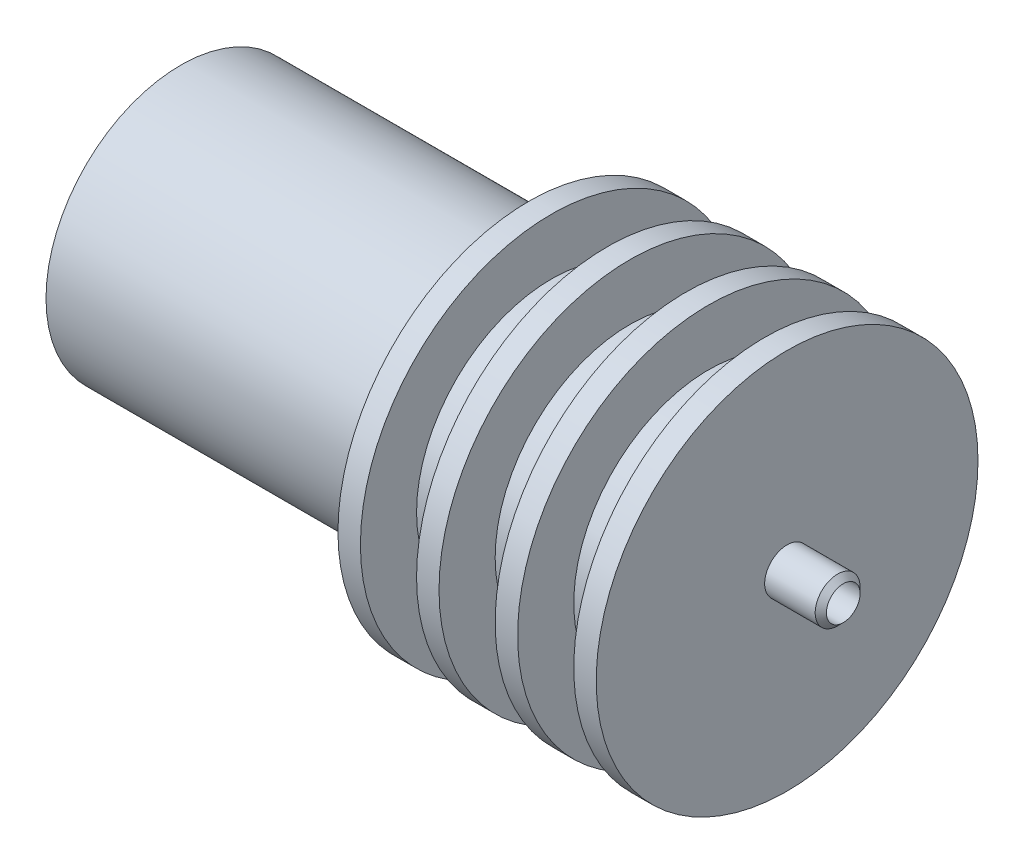
ISO-10303-21;
HEADER;
FILE_DESCRIPTION(('STEP AP214'),'2;1');
FILE_NAME('part.step','',(''),(''),'','','');
FILE_SCHEMA(('AUTOMOTIVE_DESIGN { 1 0 10303 214 1 1 1 1 }'));
ENDSEC;
DATA;
#1=APPLICATION_CONTEXT('core data for automotive mechanical design processes');
#2=APPLICATION_PROTOCOL_DEFINITION('international standard','automotive_design',2000,#1);
#3=PRODUCT_CONTEXT('',#1,'mechanical');
#4=PRODUCT('Part','Part','',(#3));
#5=PRODUCT_RELATED_PRODUCT_CATEGORY('part','',(#4));
#6=PRODUCT_DEFINITION_FORMATION('','',#4);
#7=PRODUCT_DEFINITION_CONTEXT('part definition',#1,'design');
#8=PRODUCT_DEFINITION('design','',#6,#7);
#9=PRODUCT_DEFINITION_SHAPE('','',#8);
#10=(LENGTH_UNIT() NAMED_UNIT(*) SI_UNIT(.MILLI.,.METRE.));
#11=(NAMED_UNIT(*) PLANE_ANGLE_UNIT() SI_UNIT($,.RADIAN.));
#12=(NAMED_UNIT(*) SI_UNIT($,.STERADIAN.) SOLID_ANGLE_UNIT());
#13=UNCERTAINTY_MEASURE_WITH_UNIT(LENGTH_MEASURE(1.E-05),#10,'distance_accuracy_value','');
#14=(GEOMETRIC_REPRESENTATION_CONTEXT(3) GLOBAL_UNCERTAINTY_ASSIGNED_CONTEXT((#13)) GLOBAL_UNIT_ASSIGNED_CONTEXT((#10,
#11,#12)) REPRESENTATION_CONTEXT('',''));
#15=CARTESIAN_POINT('',(0.,0.,0.));
#16=DIRECTION('',(0.,0.,1.));
#17=DIRECTION('',(1.,0.,0.));
#18=AXIS2_PLACEMENT_3D('',#15,#16,#17);
#19=CARTESIAN_POINT('',(28.,0.,0.));
#20=DIRECTION('',(1.,0.,0.));
#21=DIRECTION('',(0.,0.,-1.));
#22=AXIS2_PLACEMENT_3D('',#19,#20,#21);
#23=PLANE('',#22);
#24=CARTESIAN_POINT('',(28.,0.,0.));
#25=DIRECTION('',(1.,0.,0.));
#26=DIRECTION('',(0.,0.,-1.));
#27=AXIS2_PLACEMENT_3D('',#24,#25,#26);
#28=CIRCLE('',#27,17.);
#29=CARTESIAN_POINT('',(28.,0.,-17.));
#30=VERTEX_POINT('',#29);
#31=EDGE_CURVE('E101',#30,#30,#28,.T.);
#32=ORIENTED_EDGE('',*,*,#31,.T.);
#33=EDGE_LOOP('',(#32));
#34=FACE_BOUND('',#33,.T.);
#35=CARTESIAN_POINT('',(28.,0.,0.));
#36=DIRECTION('',(1.,0.,0.));
#37=DIRECTION('',(0.,0.,-1.));
#38=AXIS2_PLACEMENT_3D('',#35,#36,#37);
#39=CIRCLE('',#38,2.);
#40=CARTESIAN_POINT('',(28.,0.,-2.));
#41=VERTEX_POINT('',#40);
#42=EDGE_CURVE('E105',#41,#41,#39,.T.);
#43=ORIENTED_EDGE('',*,*,#42,.F.);
#44=EDGE_LOOP('',(#43));
#45=FACE_BOUND('',#44,.T.);
#46=ADVANCED_FACE('F62',(#34,#45),#23,.T.);
#47=CARTESIAN_POINT('',(28.,0.,0.));
#48=DIRECTION('',(-1.,0.,0.));
#49=DIRECTION('',(0.,0.,1.));
#50=AXIS2_PLACEMENT_3D('',#47,#48,#49);
#51=CYLINDRICAL_SURFACE('',#50,12.);
#52=CARTESIAN_POINT('',(23.,0.,0.));
#53=DIRECTION('',(1.,0.,0.));
#54=DIRECTION('',(0.,0.,-1.));
#55=AXIS2_PLACEMENT_3D('',#52,#53,#54);
#56=CIRCLE('',#55,12.);
#57=CARTESIAN_POINT('',(23.,0.,-12.));
#58=VERTEX_POINT('',#57);
#59=EDGE_CURVE('E79',#58,#58,#56,.T.);
#60=ORIENTED_EDGE('',*,*,#59,.T.);
#61=EDGE_LOOP('',(#60));
#62=FACE_BOUND('',#61,.T.);
#63=CARTESIAN_POINT('',(26.,0.,0.));
#64=DIRECTION('',(1.,0.,0.));
#65=DIRECTION('',(0.,0.,-1.));
#66=AXIS2_PLACEMENT_3D('',#63,#64,#65);
#67=CIRCLE('',#66,12.);
#68=CARTESIAN_POINT('',(26.,0.,-12.));
#69=VERTEX_POINT('',#68);
#70=EDGE_CURVE('E71',#69,#69,#67,.T.);
#71=ORIENTED_EDGE('',*,*,#70,.F.);
#72=EDGE_LOOP('',(#71));
#73=FACE_BOUND('',#72,.T.);
#74=ADVANCED_FACE('F128',(#62,#73),#51,.T.);
#75=CARTESIAN_POINT('',(23.,0.,0.));
#76=DIRECTION('',(1.,0.,0.));
#77=DIRECTION('',(0.,0.,-1.));
#78=AXIS2_PLACEMENT_3D('',#75,#76,#77);
#79=PLANE('',#78);
#80=CARTESIAN_POINT('',(23.,0.,0.));
#81=DIRECTION('',(1.,0.,0.));
#82=DIRECTION('',(0.,0.,-1.));
#83=AXIS2_PLACEMENT_3D('',#80,#81,#82);
#84=CIRCLE('',#83,10.);
#85=CARTESIAN_POINT('',(23.,0.,10.));
#86=VERTEX_POINT('',#85);
#87=EDGE_CURVE('E87',#86,#86,#84,.T.);
#88=ORIENTED_EDGE('',*,*,#87,.T.);
#89=EDGE_LOOP('',(#88));
#90=FACE_BOUND('',#89,.T.);
#91=ORIENTED_EDGE('',*,*,#59,.F.);
#92=EDGE_LOOP('',(#91));
#93=FACE_BOUND('',#92,.T.);
#94=ADVANCED_FACE('F134',(#90,#93),#79,.F.);
#95=CARTESIAN_POINT('',(26.,0.,0.));
#96=DIRECTION('',(-1.,0.,0.));
#97=DIRECTION('',(0.,0.,1.));
#98=AXIS2_PLACEMENT_3D('',#95,#96,#97);
#99=CYLINDRICAL_SURFACE('',#98,10.);
#100=CARTESIAN_POINT('',(26.,0.,0.));
#101=DIRECTION('',(-1.,0.,0.));
#102=DIRECTION('',(0.,0.,1.));
#103=AXIS2_PLACEMENT_3D('',#100,#101,#102);
#104=CIRCLE('',#103,10.);
#105=CARTESIAN_POINT('',(26.,0.,10.));
#106=VERTEX_POINT('',#105);
#107=EDGE_CURVE('E93',#106,#106,#104,.T.);
#108=CARTESIAN_POINT('',(26.,0.,10.));
#109=CARTESIAN_POINT('',(25.96875,0.,10.));
#110=CARTESIAN_POINT('',(25.9375,0.,10.));
#111=CARTESIAN_POINT('',(25.875,0.,10.));
#112=CARTESIAN_POINT('',(25.84375,0.,10.));
#113=CARTESIAN_POINT('',(25.78125,0.,10.));
#114=CARTESIAN_POINT('',(25.75,0.,10.));
#115=CARTESIAN_POINT('',(25.6875,0.,10.));
#116=CARTESIAN_POINT('',(25.65625,0.,10.));
#117=CARTESIAN_POINT('',(25.59375,0.,10.));
#118=CARTESIAN_POINT('',(25.5625,0.,10.));
#119=CARTESIAN_POINT('',(25.5,0.,10.));
#120=CARTESIAN_POINT('',(25.46875,0.,10.));
#121=CARTESIAN_POINT('',(25.40625,0.,10.));
#122=CARTESIAN_POINT('',(25.375,0.,10.));
#123=CARTESIAN_POINT('',(25.3125,0.,10.));
#124=CARTESIAN_POINT('',(25.28125,0.,10.));
#125=CARTESIAN_POINT('',(25.21875,0.,10.));
#126=CARTESIAN_POINT('',(25.1875,0.,10.));
#127=CARTESIAN_POINT('',(25.125,0.,10.));
#128=CARTESIAN_POINT('',(25.09375,0.,10.));
#129=CARTESIAN_POINT('',(25.03125,0.,10.));
#130=CARTESIAN_POINT('',(25.,0.,10.));
#131=CARTESIAN_POINT('',(24.9375,0.,10.));
#132=CARTESIAN_POINT('',(24.90625,0.,10.));
#133=CARTESIAN_POINT('',(24.84375,0.,10.));
#134=CARTESIAN_POINT('',(24.8125,0.,10.));
#135=CARTESIAN_POINT('',(24.75,0.,10.));
#136=CARTESIAN_POINT('',(24.71875,0.,10.));
#137=CARTESIAN_POINT('',(24.65625,0.,10.));
#138=CARTESIAN_POINT('',(24.625,0.,10.));
#139=CARTESIAN_POINT('',(24.5625,0.,10.));
#140=CARTESIAN_POINT('',(24.53125,0.,10.));
#141=CARTESIAN_POINT('',(24.46875,0.,10.));
#142=CARTESIAN_POINT('',(24.4375,0.,10.));
#143=CARTESIAN_POINT('',(24.375,0.,10.));
#144=CARTESIAN_POINT('',(24.34375,0.,10.));
#145=CARTESIAN_POINT('',(24.28125,0.,10.));
#146=CARTESIAN_POINT('',(24.25,0.,10.));
#147=CARTESIAN_POINT('',(24.1875,0.,10.));
#148=CARTESIAN_POINT('',(24.15625,0.,10.));
#149=CARTESIAN_POINT('',(24.09375,0.,10.));
#150=CARTESIAN_POINT('',(24.0625,0.,10.));
#151=CARTESIAN_POINT('',(24.,0.,10.));
#152=CARTESIAN_POINT('',(23.96875,0.,10.));
#153=CARTESIAN_POINT('',(23.90625,0.,10.));
#154=CARTESIAN_POINT('',(23.875,0.,10.));
#155=CARTESIAN_POINT('',(23.8125,0.,10.));
#156=CARTESIAN_POINT('',(23.78125,0.,10.));
#157=CARTESIAN_POINT('',(23.71875,0.,10.));
#158=CARTESIAN_POINT('',(23.6875,0.,10.));
#159=CARTESIAN_POINT('',(23.625,0.,10.));
#160=CARTESIAN_POINT('',(23.59375,0.,10.));
#161=CARTESIAN_POINT('',(23.53125,0.,10.));
#162=CARTESIAN_POINT('',(23.5,0.,10.));
#163=CARTESIAN_POINT('',(23.4375,0.,10.));
#164=CARTESIAN_POINT('',(23.40625,0.,10.));
#165=CARTESIAN_POINT('',(23.34375,0.,10.));
#166=CARTESIAN_POINT('',(23.3125,0.,10.));
#167=CARTESIAN_POINT('',(23.25,0.,10.));
#168=CARTESIAN_POINT('',(23.21875,0.,10.));
#169=CARTESIAN_POINT('',(23.15625,0.,10.));
#170=CARTESIAN_POINT('',(23.125,0.,10.));
#171=CARTESIAN_POINT('',(23.0625,0.,10.));
#172=CARTESIAN_POINT('',(23.03125,0.,10.));
#173=CARTESIAN_POINT('',(23.,0.,10.));
#174=B_SPLINE_CURVE_WITH_KNOTS('',3,(#108,#109,#110,#111,#112,#113,#114,#115,#116,#117,#118,
#119,#120,#121,#122,#123,#124,#125,#126,#127,#128,#129,#130,#131,#132,#133,#134,#135,#136,#137,
#138,#139,#140,#141,#142,#143,#144,#145,#146,#147,#148,#149,#150,#151,#152,#153,#154,#155,#156,
#157,#158,#159,#160,#161,#162,#163,#164,#165,#166,#167,#168,#169,#170,#171,#172,#173),
.UNSPECIFIED.,.F.,.F.,(4,2,2,2,2,2,2,2,2,2,2,2,2,2,2,2,2,2,2,2,2,2,2,2,2,2,2,2,2,2,2,2,4),(0.,
0.0937500000000001,0.1875,0.28125,0.375,0.46875,0.5625,0.656250000000001,0.750000000000001,
0.843750000000001,0.937500000000001,1.03125,1.125,1.21875,1.3125,1.40625,1.5,1.59375,1.6875,
1.78125,1.875,1.96875,2.0625,2.15625,2.25,2.34375,2.4375,2.53125,2.625,2.71875,2.8125,2.90625,
3.),.UNSPECIFIED.);
#175=EDGE_CURVE('BSEAM139',#106,#86,#174,.T.);
#176=ORIENTED_EDGE('',*,*,#107,.F.);
#177=ORIENTED_EDGE('',*,*,#87,.F.);
#178=ORIENTED_EDGE('',*,*,#175,.T.);
#179=ORIENTED_EDGE('',*,*,#175,.F.);
#180=EDGE_LOOP('',(#176,#178,#177,#179));
#181=FACE_BOUND('',#180,.T.);
#182=ADVANCED_FACE('F139',(#181),#99,.F.);
#183=CARTESIAN_POINT('',(26.,0.,0.));
#184=DIRECTION('',(-1.,0.,0.));
#185=DIRECTION('',(0.,0.,1.));
#186=AXIS2_PLACEMENT_3D('',#183,#184,#185);
#187=PLANE('',#186);
#188=CARTESIAN_POINT('',(26.,0.,0.));
#189=DIRECTION('',(-1.,0.,0.));
#190=DIRECTION('',(0.,0.,1.));
#191=AXIS2_PLACEMENT_3D('',#188,#189,#190);
#192=CIRCLE('',#191,1.5);
#193=CARTESIAN_POINT('',(26.,0.,1.5));
#194=VERTEX_POINT('',#193);
#195=EDGE_CURVE('E90',#194,#194,#192,.T.);
#196=ORIENTED_EDGE('',*,*,#195,.F.);
#197=EDGE_LOOP('',(#196));
#198=FACE_BOUND('',#197,.T.);
#199=ORIENTED_EDGE('',*,*,#107,.T.);
#200=EDGE_LOOP('',(#199));
#201=FACE_BOUND('',#200,.T.);
#202=ADVANCED_FACE('F146',(#198,#201),#187,.T.);
#203=CARTESIAN_POINT('',(-26.,0.,0.));
#204=DIRECTION('',(1.,0.,0.));
#205=DIRECTION('',(0.,0.,-1.));
#206=AXIS2_PLACEMENT_3D('',#203,#204,#205);
#207=CYLINDRICAL_SURFACE('',#206,1.5);
#208=ORIENTED_EDGE('',*,*,#195,.T.);
#209=EDGE_LOOP('',(#208));
#210=FACE_BOUND('',#209,.T.);
#211=CARTESIAN_POINT('',(33.,0.,0.));
#212=DIRECTION('',(1.,0.,0.));
#213=DIRECTION('',(0.,0.,-1.));
#214=AXIS2_PLACEMENT_3D('',#211,#212,#213);
#215=CIRCLE('',#214,1.5);
#216=CARTESIAN_POINT('',(33.,0.,-1.5));
#217=VERTEX_POINT('',#216);
#218=EDGE_CURVE('E111',#217,#217,#215,.T.);
#219=ORIENTED_EDGE('',*,*,#218,.T.);
#220=EDGE_LOOP('',(#219));
#221=FACE_BOUND('',#220,.T.);
#222=ADVANCED_FACE('F118',(#210,#221),#207,.F.);
#223=CARTESIAN_POINT('',(26.,0.,0.));
#224=DIRECTION('',(1.,0.,0.));
#225=DIRECTION('',(0.,0.,-1.));
#226=AXIS2_PLACEMENT_3D('',#223,#224,#225);
#227=CYLINDRICAL_SURFACE('',#226,17.);
#228=CARTESIAN_POINT('',(26.,0.,0.));
#229=DIRECTION('',(1.,0.,0.));
#230=DIRECTION('',(0.,0.,-1.));
#231=AXIS2_PLACEMENT_3D('',#228,#229,#230);
#232=CIRCLE('',#231,17.);
#233=CARTESIAN_POINT('',(26.,0.,-17.));
#234=VERTEX_POINT('',#233);
#235=EDGE_CURVE('E94',#234,#234,#232,.T.);
#236=ORIENTED_EDGE('',*,*,#235,.T.);
#237=EDGE_LOOP('',(#236));
#238=FACE_BOUND('',#237,.T.);
#239=ORIENTED_EDGE('',*,*,#31,.F.);
#240=EDGE_LOOP('',(#239));
#241=FACE_BOUND('',#240,.T.);
#242=ADVANCED_FACE('F161',(#238,#241),#227,.T.);
#243=CARTESIAN_POINT('',(26.,0.,0.));
#244=DIRECTION('',(1.,0.,0.));
#245=DIRECTION('',(0.,0.,-1.));
#246=AXIS2_PLACEMENT_3D('',#243,#244,#245);
#247=PLANE('',#246);
#248=ORIENTED_EDGE('',*,*,#70,.T.);
#249=EDGE_LOOP('',(#248));
#250=FACE_BOUND('',#249,.T.);
#251=ORIENTED_EDGE('',*,*,#235,.F.);
#252=EDGE_LOOP('',(#251));
#253=FACE_BOUND('',#252,.T.);
#254=ADVANCED_FACE('F125',(#250,#253),#247,.F.);
#255=CARTESIAN_POINT('',(33.,0.,0.));
#256=DIRECTION('',(-1.,0.,0.));
#257=DIRECTION('',(0.,0.,1.));
#258=AXIS2_PLACEMENT_3D('',#255,#256,#257);
#259=CYLINDRICAL_SURFACE('',#258,2.);
#260=CARTESIAN_POINT('',(32.5,0.,0.));
#261=DIRECTION('',(1.,0.,0.));
#262=DIRECTION('',(0.,0.,-1.));
#263=AXIS2_PLACEMENT_3D('',#260,#261,#262);
#264=CIRCLE('',#263,2.);
#265=CARTESIAN_POINT('',(32.5,0.,-2.));
#266=VERTEX_POINT('',#265);
#267=EDGE_CURVE('E12',#266,#266,#264,.F.);
#268=ORIENTED_EDGE('',*,*,#267,.T.);
#269=EDGE_LOOP('',(#268));
#270=FACE_BOUND('',#269,.T.);
#271=ORIENTED_EDGE('',*,*,#42,.T.);
#272=EDGE_LOOP('',(#271));
#273=FACE_BOUND('',#272,.T.);
#274=ADVANCED_FACE('F121',(#270,#273),#259,.T.);
#275=CARTESIAN_POINT('',(33.,0.,0.));
#276=DIRECTION('',(-1.,0.,0.));
#277=DIRECTION('',(0.,0.,1.));
#278=AXIS2_PLACEMENT_3D('',#275,#276,#277);
#279=CONICAL_SURFACE('',#278,1.50000000000001,0.78539816339744);
#280=ORIENTED_EDGE('',*,*,#267,.F.);
#281=EDGE_LOOP('',(#280));
#282=FACE_BOUND('',#281,.T.);
#283=ORIENTED_EDGE('',*,*,#218,.F.);
#284=EDGE_LOOP('',(#283));
#285=FACE_BOUND('',#284,.T.);
#286=ADVANCED_FACE('F65',(#282,#285),#279,.T.);
#287=CLOSED_SHELL('',(#46,#74,#94,#182,#202,#222,#242,#254,#274,#286));
#288=MANIFOLD_SOLID_BREP('B2',#287);
#289=CARTESIAN_POINT('',(-26.,0.,0.));
#290=DIRECTION('',(-1.,0.,0.));
#291=DIRECTION('',(0.,0.,1.));
#292=AXIS2_PLACEMENT_3D('',#289,#290,#291);
#293=CYLINDRICAL_SURFACE('',#292,12.);
#294=CARTESIAN_POINT('',(12.,0.,0.));
#295=DIRECTION('',(-1.,0.,0.));
#296=DIRECTION('',(0.,0.,1.));
#297=AXIS2_PLACEMENT_3D('',#294,#295,#296);
#298=CIRCLE('',#297,12.);
#299=CARTESIAN_POINT('',(12.,0.,12.));
#300=VERTEX_POINT('',#299);
#301=EDGE_CURVE('E301',#300,#300,#298,.T.);
#302=ORIENTED_EDGE('',*,*,#301,.T.);
#303=EDGE_LOOP('',(#302));
#304=FACE_BOUND('',#303,.T.);
#305=CARTESIAN_POINT('',(6.99999999999999,0.,0.));
#306=DIRECTION('',(-1.,0.,0.));
#307=DIRECTION('',(0.,0.,1.));
#308=AXIS2_PLACEMENT_3D('',#305,#306,#307);
#309=CIRCLE('',#308,12.);
#310=CARTESIAN_POINT('',(6.99999999999999,0.,12.));
#311=VERTEX_POINT('',#310);
#312=EDGE_CURVE('E61',#311,#311,#309,.T.);
#313=ORIENTED_EDGE('',*,*,#312,.F.);
#314=EDGE_LOOP('',(#313));
#315=FACE_BOUND('',#314,.T.);
#316=ADVANCED_FACE('F275',(#304,#315),#293,.T.);
#317=CARTESIAN_POINT('',(19.,0.,0.));
#318=DIRECTION('',(1.,0.,0.));
#319=DIRECTION('',(0.,0.,-1.));
#320=AXIS2_PLACEMENT_3D('',#317,#318,#319);
#321=CIRCLE('',#320,12.);
#322=CARTESIAN_POINT('',(19.,0.,-12.));
#323=VERTEX_POINT('',#322);
#324=EDGE_CURVE('E292',#323,#323,#321,.T.);
#325=ORIENTED_EDGE('',*,*,#324,.F.);
#326=EDGE_LOOP('',(#325));
#327=FACE_BOUND('',#326,.T.);
#328=CARTESIAN_POINT('',(14.,0.,0.));
#329=DIRECTION('',(-1.,0.,0.));
#330=DIRECTION('',(0.,0.,1.));
#331=AXIS2_PLACEMENT_3D('',#328,#329,#330);
#332=CIRCLE('',#331,12.);
#333=CARTESIAN_POINT('',(14.,0.,12.));
#334=VERTEX_POINT('',#333);
#335=EDGE_CURVE('E279',#334,#334,#332,.T.);
#336=ORIENTED_EDGE('',*,*,#335,.F.);
#337=EDGE_LOOP('',(#336));
#338=FACE_BOUND('',#337,.T.);
#339=ADVANCED_FACE('F349',(#327,#338),#293,.T.);
#340=CARTESIAN_POINT('',(4.99999999999999,0.,0.));
#341=DIRECTION('',(-1.,0.,0.));
#342=DIRECTION('',(0.,0.,1.));
#343=AXIS2_PLACEMENT_3D('',#340,#341,#342);
#344=CIRCLE('',#343,12.);
#345=CARTESIAN_POINT('',(4.99999999999999,0.,12.));
#346=VERTEX_POINT('',#345);
#347=EDGE_CURVE('E297',#346,#346,#344,.T.);
#348=ORIENTED_EDGE('',*,*,#347,.T.);
#349=EDGE_LOOP('',(#348));
#350=FACE_BOUND('',#349,.T.);
#351=CARTESIAN_POINT('',(-26.,0.,0.));
#352=DIRECTION('',(-1.,0.,0.));
#353=DIRECTION('',(0.,0.,1.));
#354=AXIS2_PLACEMENT_3D('',#351,#352,#353);
#355=CIRCLE('',#354,12.);
#356=CARTESIAN_POINT('',(-26.,0.,12.));
#357=VERTEX_POINT('',#356);
#358=EDGE_CURVE('E334',#357,#357,#355,.T.);
#359=ORIENTED_EDGE('',*,*,#358,.F.);
#360=EDGE_LOOP('',(#359));
#361=FACE_BOUND('',#360,.T.);
#362=ADVANCED_FACE('F352',(#350,#361),#293,.T.);
#363=CARTESIAN_POINT('',(21.,0.,0.));
#364=DIRECTION('',(1.,0.,0.));
#365=DIRECTION('',(0.,0.,-1.));
#366=AXIS2_PLACEMENT_3D('',#363,#364,#365);
#367=CIRCLE('',#366,12.);
#368=CARTESIAN_POINT('',(21.,0.,-12.));
#369=VERTEX_POINT('',#368);
#370=EDGE_CURVE('E311',#369,#369,#367,.T.);
#371=ORIENTED_EDGE('',*,*,#370,.T.);
#372=EDGE_LOOP('',(#371));
#373=FACE_BOUND('',#372,.T.);
#374=CARTESIAN_POINT('',(23.,0.,0.));
#375=DIRECTION('',(1.,0.,0.));
#376=DIRECTION('',(0.,0.,-1.));
#377=AXIS2_PLACEMENT_3D('',#374,#375,#376);
#378=CIRCLE('',#377,12.);
#379=CARTESIAN_POINT('',(23.,0.,-12.));
#380=VERTEX_POINT('',#379);
#381=EDGE_CURVE('E330',#380,#380,#378,.T.);
#382=ORIENTED_EDGE('',*,*,#381,.F.);
#383=EDGE_LOOP('',(#382));
#384=FACE_BOUND('',#383,.T.);
#385=ADVANCED_FACE('F277',(#373,#384),#293,.T.);
#386=CARTESIAN_POINT('',(-26.,0.,0.));
#387=DIRECTION('',(-1.,0.,0.));
#388=DIRECTION('',(0.,0.,1.));
#389=AXIS2_PLACEMENT_3D('',#386,#387,#388);
#390=CYLINDRICAL_SURFACE('',#389,10.);
#391=CARTESIAN_POINT('',(-26.,0.,0.));
#392=DIRECTION('',(-1.,0.,0.));
#393=DIRECTION('',(0.,0.,1.));
#394=AXIS2_PLACEMENT_3D('',#391,#392,#393);
#395=CIRCLE('',#394,10.);
#396=CARTESIAN_POINT('',(-26.,0.,10.));
#397=VERTEX_POINT('',#396);
#398=EDGE_CURVE('E338',#397,#397,#395,.T.);
#399=ORIENTED_EDGE('',*,*,#398,.T.);
#400=EDGE_LOOP('',(#399));
#401=FACE_BOUND('',#400,.T.);
#402=CARTESIAN_POINT('',(23.,0.,0.));
#403=DIRECTION('',(1.,0.,0.));
#404=DIRECTION('',(0.,0.,-1.));
#405=AXIS2_PLACEMENT_3D('',#402,#403,#404);
#406=CIRCLE('',#405,10.);
#407=CARTESIAN_POINT('',(23.,0.,-10.));
#408=VERTEX_POINT('',#407);
#409=EDGE_CURVE('E323',#408,#408,#406,.T.);
#410=ORIENTED_EDGE('',*,*,#409,.T.);
#411=EDGE_LOOP('',(#410));
#412=FACE_BOUND('',#411,.T.);
#413=ADVANCED_FACE('F377',(#401,#412),#390,.F.);
#414=CARTESIAN_POINT('',(-26.,10.,0.));
#415=DIRECTION('',(1.,0.,0.));
#416=DIRECTION('',(0.,0.,-1.));
#417=AXIS2_PLACEMENT_3D('',#414,#415,#416);
#418=PLANE('',#417);
#419=ORIENTED_EDGE('',*,*,#398,.F.);
#420=EDGE_LOOP('',(#419));
#421=FACE_BOUND('',#420,.T.);
#422=ORIENTED_EDGE('',*,*,#358,.T.);
#423=EDGE_LOOP('',(#422));
#424=FACE_BOUND('',#423,.T.);
#425=ADVANCED_FACE('F383',(#421,#424),#418,.F.);
#426=CARTESIAN_POINT('',(23.,0.,0.));
#427=DIRECTION('',(1.,0.,0.));
#428=DIRECTION('',(0.,0.,-1.));
#429=AXIS2_PLACEMENT_3D('',#426,#427,#428);
#430=PLANE('',#429);
#431=ORIENTED_EDGE('',*,*,#381,.T.);
#432=EDGE_LOOP('',(#431));
#433=FACE_BOUND('',#432,.T.);
#434=ORIENTED_EDGE('',*,*,#409,.F.);
#435=EDGE_LOOP('',(#434));
#436=FACE_BOUND('',#435,.T.);
#437=ADVANCED_FACE('F390',(#433,#436),#430,.T.);
#438=CARTESIAN_POINT('',(19.,0.,0.));
#439=DIRECTION('',(1.,0.,0.));
#440=DIRECTION('',(0.,0.,-1.));
#441=AXIS2_PLACEMENT_3D('',#438,#439,#440);
#442=CYLINDRICAL_SURFACE('',#441,17.);
#443=CARTESIAN_POINT('',(19.,0.,0.));
#444=DIRECTION('',(1.,0.,0.));
#445=DIRECTION('',(0.,0.,-1.));
#446=AXIS2_PLACEMENT_3D('',#443,#444,#445);
#447=CIRCLE('',#446,17.);
#448=CARTESIAN_POINT('',(19.,0.,-17.));
#449=VERTEX_POINT('',#448);
#450=EDGE_CURVE('E319',#449,#449,#447,.T.);
#451=ORIENTED_EDGE('',*,*,#450,.T.);
#452=EDGE_LOOP('',(#451));
#453=FACE_BOUND('',#452,.T.);
#454=CARTESIAN_POINT('',(21.,0.,0.));
#455=DIRECTION('',(1.,0.,0.));
#456=DIRECTION('',(0.,0.,-1.));
#457=AXIS2_PLACEMENT_3D('',#454,#455,#456);
#458=CIRCLE('',#457,17.);
#459=CARTESIAN_POINT('',(21.,0.,-17.));
#460=VERTEX_POINT('',#459);
#461=EDGE_CURVE('E318',#460,#460,#458,.T.);
#462=ORIENTED_EDGE('',*,*,#461,.F.);
#463=EDGE_LOOP('',(#462));
#464=FACE_BOUND('',#463,.T.);
#465=ADVANCED_FACE('F393',(#453,#464),#442,.T.);
#466=CARTESIAN_POINT('',(19.,0.,0.));
#467=DIRECTION('',(1.,0.,0.));
#468=DIRECTION('',(0.,0.,-1.));
#469=AXIS2_PLACEMENT_3D('',#466,#467,#468);
#470=PLANE('',#469);
#471=ORIENTED_EDGE('',*,*,#324,.T.);
#472=EDGE_LOOP('',(#471));
#473=FACE_BOUND('',#472,.T.);
#474=ORIENTED_EDGE('',*,*,#450,.F.);
#475=EDGE_LOOP('',(#474));
#476=FACE_BOUND('',#475,.T.);
#477=ADVANCED_FACE('F346',(#473,#476),#470,.F.);
#478=CARTESIAN_POINT('',(21.,0.,0.));
#479=DIRECTION('',(1.,0.,0.));
#480=DIRECTION('',(0.,0.,-1.));
#481=AXIS2_PLACEMENT_3D('',#478,#479,#480);
#482=PLANE('',#481);
#483=ORIENTED_EDGE('',*,*,#370,.F.);
#484=EDGE_LOOP('',(#483));
#485=FACE_BOUND('',#484,.T.);
#486=ORIENTED_EDGE('',*,*,#461,.T.);
#487=EDGE_LOOP('',(#486));
#488=FACE_BOUND('',#487,.T.);
#489=ADVANCED_FACE('F367',(#485,#488),#482,.T.);
#490=CARTESIAN_POINT('',(12.,0.,0.));
#491=DIRECTION('',(-1.,0.,0.));
#492=DIRECTION('',(0.,0.,1.));
#493=AXIS2_PLACEMENT_3D('',#490,#491,#492);
#494=PLANE('',#493);
#495=CARTESIAN_POINT('',(12.,0.,0.));
#496=DIRECTION('',(-1.,0.,0.));
#497=DIRECTION('',(0.,0.,1.));
#498=AXIS2_PLACEMENT_3D('',#495,#496,#497);
#499=CIRCLE('',#498,17.);
#500=CARTESIAN_POINT('',(12.,0.,17.));
#501=VERTEX_POINT('',#500);
#502=EDGE_CURVE('E307',#501,#501,#499,.T.);
#503=ORIENTED_EDGE('',*,*,#502,.T.);
#504=EDGE_LOOP('',(#503));
#505=FACE_BOUND('',#504,.T.);
#506=ORIENTED_EDGE('',*,*,#301,.F.);
#507=EDGE_LOOP('',(#506));
#508=FACE_BOUND('',#507,.T.);
#509=ADVANCED_FACE('F358',(#505,#508),#494,.T.);
#510=CARTESIAN_POINT('',(14.,0.,0.));
#511=DIRECTION('',(-1.,0.,0.));
#512=DIRECTION('',(0.,0.,1.));
#513=AXIS2_PLACEMENT_3D('',#510,#511,#512);
#514=PLANE('',#513);
#515=CARTESIAN_POINT('',(14.,0.,0.));
#516=DIRECTION('',(-1.,0.,0.));
#517=DIRECTION('',(0.,0.,1.));
#518=AXIS2_PLACEMENT_3D('',#515,#516,#517);
#519=CIRCLE('',#518,17.);
#520=CARTESIAN_POINT('',(14.,0.,17.));
#521=VERTEX_POINT('',#520);
#522=EDGE_CURVE('E306',#521,#521,#519,.T.);
#523=ORIENTED_EDGE('',*,*,#522,.F.);
#524=EDGE_LOOP('',(#523));
#525=FACE_BOUND('',#524,.T.);
#526=ORIENTED_EDGE('',*,*,#335,.T.);
#527=EDGE_LOOP('',(#526));
#528=FACE_BOUND('',#527,.T.);
#529=ADVANCED_FACE('F355',(#525,#528),#514,.F.);
#530=CARTESIAN_POINT('',(12.,0.,0.));
#531=DIRECTION('',(1.,0.,0.));
#532=DIRECTION('',(0.,0.,-1.));
#533=AXIS2_PLACEMENT_3D('',#530,#531,#532);
#534=CYLINDRICAL_SURFACE('',#533,17.);
#535=ORIENTED_EDGE('',*,*,#502,.F.);
#536=EDGE_LOOP('',(#535));
#537=FACE_BOUND('',#536,.T.);
#538=ORIENTED_EDGE('',*,*,#522,.T.);
#539=EDGE_LOOP('',(#538));
#540=FACE_BOUND('',#539,.T.);
#541=ADVANCED_FACE('F357',(#537,#540),#534,.T.);
#542=CARTESIAN_POINT('',(4.99999999999999,0.,0.));
#543=DIRECTION('',(-1.,0.,0.));
#544=DIRECTION('',(0.,0.,1.));
#545=AXIS2_PLACEMENT_3D('',#542,#543,#544);
#546=PLANE('',#545);
#547=CARTESIAN_POINT('',(4.99999999999999,0.,0.));
#548=DIRECTION('',(-1.,0.,0.));
#549=DIRECTION('',(0.,0.,1.));
#550=AXIS2_PLACEMENT_3D('',#547,#548,#549);
#551=CIRCLE('',#550,17.);
#552=CARTESIAN_POINT('',(4.99999999999999,0.,17.));
#553=VERTEX_POINT('',#552);
#554=EDGE_CURVE('E302',#553,#553,#551,.T.);
#555=ORIENTED_EDGE('',*,*,#554,.T.);
#556=EDGE_LOOP('',(#555));
#557=FACE_BOUND('',#556,.T.);
#558=ORIENTED_EDGE('',*,*,#347,.F.);
#559=EDGE_LOOP('',(#558));
#560=FACE_BOUND('',#559,.T.);
#561=ADVANCED_FACE('F364',(#557,#560),#546,.T.);
#562=CARTESIAN_POINT('',(6.99999999999999,0.,0.));
#563=DIRECTION('',(-1.,0.,0.));
#564=DIRECTION('',(0.,0.,1.));
#565=AXIS2_PLACEMENT_3D('',#562,#563,#564);
#566=PLANE('',#565);
#567=CARTESIAN_POINT('',(6.99999999999999,0.,0.));
#568=DIRECTION('',(-1.,0.,0.));
#569=DIRECTION('',(0.,0.,1.));
#570=AXIS2_PLACEMENT_3D('',#567,#568,#569);
#571=CIRCLE('',#570,17.);
#572=CARTESIAN_POINT('',(6.99999999999999,0.,17.));
#573=VERTEX_POINT('',#572);
#574=EDGE_CURVE('E295',#573,#573,#571,.T.);
#575=ORIENTED_EDGE('',*,*,#574,.F.);
#576=EDGE_LOOP('',(#575));
#577=FACE_BOUND('',#576,.T.);
#578=ORIENTED_EDGE('',*,*,#312,.T.);
#579=EDGE_LOOP('',(#578));
#580=FACE_BOUND('',#579,.T.);
#581=ADVANCED_FACE('F476',(#577,#580),#566,.F.);
#582=CARTESIAN_POINT('',(4.99999999999999,0.,0.));
#583=DIRECTION('',(1.,0.,0.));
#584=DIRECTION('',(0.,0.,-1.));
#585=AXIS2_PLACEMENT_3D('',#582,#583,#584);
#586=CYLINDRICAL_SURFACE('',#585,17.);
#587=ORIENTED_EDGE('',*,*,#554,.F.);
#588=EDGE_LOOP('',(#587));
#589=FACE_BOUND('',#588,.T.);
#590=ORIENTED_EDGE('',*,*,#574,.T.);
#591=EDGE_LOOP('',(#590));
#592=FACE_BOUND('',#591,.T.);
#593=ADVANCED_FACE('F485',(#589,#592),#586,.T.);
#594=CLOSED_SHELL('',(#316,#339,#362,#385,#413,#425,#437,#465,#477,#489,#509,#529,#541,#561,
#581,#593));
#595=MANIFOLD_SOLID_BREP('B7',#594);
#596=ADVANCED_BREP_SHAPE_REPRESENTATION('',(#18,#288,#595),#14);
#597=SHAPE_DEFINITION_REPRESENTATION(#9,#596);
ENDSEC;
END-ISO-10303-21;
